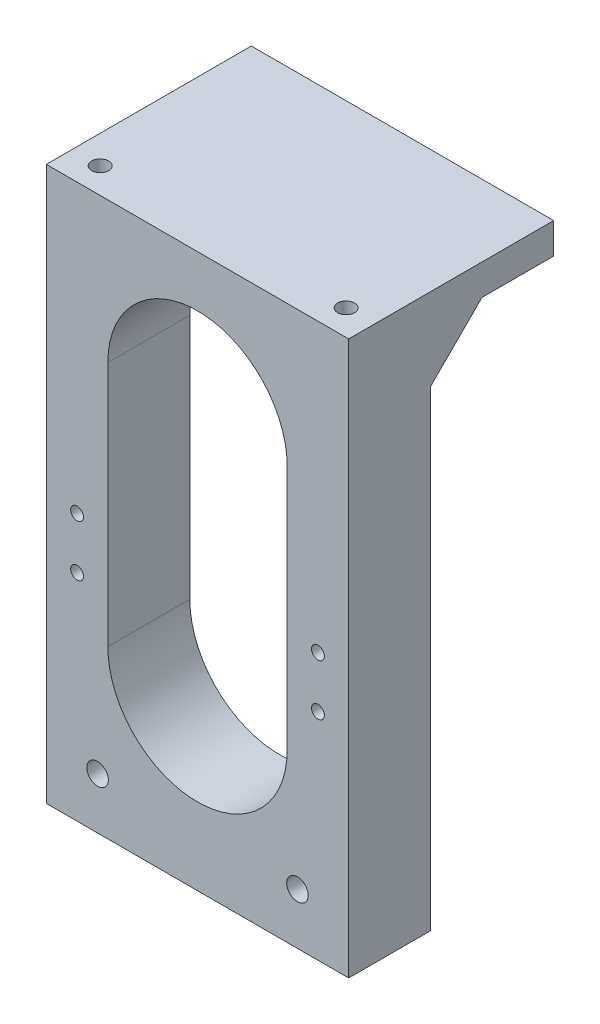
ISO-10303-21;
HEADER;
FILE_DESCRIPTION(('STEP AP214'),'2;1');
FILE_NAME('part.step','',(''),(''),'','','');
FILE_SCHEMA(('AUTOMOTIVE_DESIGN { 1 0 10303 214 1 1 1 1 }'));
ENDSEC;
DATA;
#1=APPLICATION_CONTEXT('core data for automotive mechanical design processes');
#2=APPLICATION_PROTOCOL_DEFINITION('international standard','automotive_design',2000,#1);
#3=PRODUCT_CONTEXT('',#1,'mechanical');
#4=PRODUCT('Part','Part','',(#3));
#5=PRODUCT_RELATED_PRODUCT_CATEGORY('part','',(#4));
#6=PRODUCT_DEFINITION_FORMATION('','',#4);
#7=PRODUCT_DEFINITION_CONTEXT('part definition',#1,'design');
#8=PRODUCT_DEFINITION('design','',#6,#7);
#9=PRODUCT_DEFINITION_SHAPE('','',#8);
#10=(LENGTH_UNIT() NAMED_UNIT(*) SI_UNIT(.MILLI.,.METRE.));
#11=(NAMED_UNIT(*) PLANE_ANGLE_UNIT() SI_UNIT($,.RADIAN.));
#12=(NAMED_UNIT(*) SI_UNIT($,.STERADIAN.) SOLID_ANGLE_UNIT());
#13=UNCERTAINTY_MEASURE_WITH_UNIT(LENGTH_MEASURE(1.E-05),#10,'distance_accuracy_value','');
#14=(GEOMETRIC_REPRESENTATION_CONTEXT(3) GLOBAL_UNCERTAINTY_ASSIGNED_CONTEXT((#13)) GLOBAL_UNIT_ASSIGNED_CONTEXT((#10,
#11,#12)) REPRESENTATION_CONTEXT('',''));
#15=CARTESIAN_POINT('',(0.,0.,0.));
#16=DIRECTION('',(0.,0.,1.));
#17=DIRECTION('',(1.,0.,0.));
#18=AXIS2_PLACEMENT_3D('',#15,#16,#17);
#19=CARTESIAN_POINT('',(29.5,92.,-16.));
#20=DIRECTION('',(0.,0.707106781186548,0.707106781186547));
#21=DIRECTION('',(0.,-0.707106781186547,0.707106781186548));
#22=AXIS2_PLACEMENT_3D('',#19,#20,#21);
#23=PLANE('',#22);
#24=DIRECTION('',(-1.,0.,0.));
#25=VECTOR('',#24,1.);
#26=CARTESIAN_POINT('',(29.5,92.,-16.));
#27=LINE('',#26,#25);
#28=CARTESIAN_POINT('',(29.5,92.,-16.));
#29=VERTEX_POINT('',#28);
#30=CARTESIAN_POINT('',(13.1909059582729,92.,-16.));
#31=VERTEX_POINT('',#30);
#32=EDGE_CURVE('E259',#29,#31,#27,.T.);
#33=ORIENTED_EDGE('',*,*,#32,.T.);
#34=CARTESIAN_POINT('',(0.,80.5,-4.49999999999999));
#35=DIRECTION('',(0.,0.707106781186548,0.707106781186547));
#36=DIRECTION('',(0.,-0.707106781186547,0.707106781186548));
#37=AXIS2_PLACEMENT_3D('',#34,#35,#36);
#38=ELLIPSE('',#37,24.7487373415292,17.5);
#39=CARTESIAN_POINT('',(-13.1909059582729,92.,-16.));
#40=VERTEX_POINT('',#39);
#41=EDGE_CURVE('E208',#31,#40,#38,.T.);
#42=ORIENTED_EDGE('',*,*,#41,.T.);
#43=CARTESIAN_POINT('',(-29.5,92.,-16.));
#44=VERTEX_POINT('',#43);
#45=EDGE_CURVE('E244',#40,#44,#27,.T.);
#46=ORIENTED_EDGE('',*,*,#45,.T.);
#47=DIRECTION('',(0.,0.707106781186547,-0.707106781186548));
#48=VECTOR('',#47,1.);
#49=CARTESIAN_POINT('',(-29.5,92.,-16.));
#50=LINE('',#49,#48);
#51=CARTESIAN_POINT('',(-29.5,102.,-26.));
#52=VERTEX_POINT('',#51);
#53=EDGE_CURVE('E227',#44,#52,#50,.T.);
#54=ORIENTED_EDGE('',*,*,#53,.T.);
#55=DIRECTION('',(-1.,0.,0.));
#56=VECTOR('',#55,1.);
#57=CARTESIAN_POINT('',(29.5,102.,-26.));
#58=LINE('',#57,#56);
#59=CARTESIAN_POINT('',(29.5,102.,-26.));
#60=VERTEX_POINT('',#59);
#61=EDGE_CURVE('E277',#60,#52,#58,.T.);
#62=ORIENTED_EDGE('',*,*,#61,.F.);
#63=DIRECTION('',(0.,0.707106781186547,-0.707106781186548));
#64=VECTOR('',#63,1.);
#65=CARTESIAN_POINT('',(29.5,92.,-16.));
#66=LINE('',#65,#64);
#67=EDGE_CURVE('E228',#29,#60,#66,.T.);
#68=ORIENTED_EDGE('',*,*,#67,.F.);
#69=EDGE_LOOP('',(#33,#42,#46,#54,#62,#68));
#70=FACE_BOUND('',#69,.T.);
#71=ADVANCED_FACE('F39',(#70),#23,.F.);
#72=CARTESIAN_POINT('',(29.5,102.,-26.));
#73=DIRECTION('',(0.,1.,0.));
#74=DIRECTION('',(0.,0.,1.));
#75=AXIS2_PLACEMENT_3D('',#72,#73,#74);
#76=PLANE('',#75);
#77=DIRECTION('',(0.,0.,-1.));
#78=VECTOR('',#77,1.);
#79=CARTESIAN_POINT('',(-29.5,102.,-26.));
#80=LINE('',#79,#78);
#81=CARTESIAN_POINT('',(-29.5,102.,-40.));
#82=VERTEX_POINT('',#81);
#83=EDGE_CURVE('E247',#52,#82,#80,.T.);
#84=ORIENTED_EDGE('',*,*,#83,.T.);
#85=DIRECTION('',(-1.,0.,0.));
#86=VECTOR('',#85,1.);
#87=CARTESIAN_POINT('',(29.5,102.,-40.));
#88=LINE('',#87,#86);
#89=CARTESIAN_POINT('',(29.5,102.,-40.));
#90=VERTEX_POINT('',#89);
#91=EDGE_CURVE('E274',#90,#82,#88,.T.);
#92=ORIENTED_EDGE('',*,*,#91,.F.);
#93=DIRECTION('',(0.,0.,-1.));
#94=VECTOR('',#93,1.);
#95=CARTESIAN_POINT('',(29.5,102.,-26.));
#96=LINE('',#95,#94);
#97=EDGE_CURVE('E231',#60,#90,#96,.T.);
#98=ORIENTED_EDGE('',*,*,#97,.F.);
#99=ORIENTED_EDGE('',*,*,#61,.T.);
#100=EDGE_LOOP('',(#84,#92,#98,#99));
#101=FACE_BOUND('',#100,.T.);
#102=ADVANCED_FACE('F324',(#101),#76,.F.);
#103=CARTESIAN_POINT('',(29.5,102.,-40.));
#104=DIRECTION('',(0.,0.,1.));
#105=DIRECTION('',(1.,0.,0.));
#106=AXIS2_PLACEMENT_3D('',#103,#104,#105);
#107=PLANE('',#106);
#108=DIRECTION('',(0.,1.,0.));
#109=VECTOR('',#108,1.);
#110=CARTESIAN_POINT('',(-29.5,102.,-40.));
#111=LINE('',#110,#109);
#112=CARTESIAN_POINT('',(-29.5,108.,-40.));
#113=VERTEX_POINT('',#112);
#114=EDGE_CURVE('E249',#82,#113,#111,.T.);
#115=ORIENTED_EDGE('',*,*,#114,.T.);
#116=DIRECTION('',(-1.,0.,0.));
#117=VECTOR('',#116,1.);
#118=CARTESIAN_POINT('',(29.5,108.,-40.));
#119=LINE('',#118,#117);
#120=CARTESIAN_POINT('',(29.5,108.,-40.));
#121=VERTEX_POINT('',#120);
#122=EDGE_CURVE('E271',#121,#113,#119,.T.);
#123=ORIENTED_EDGE('',*,*,#122,.F.);
#124=DIRECTION('',(0.,1.,0.));
#125=VECTOR('',#124,1.);
#126=CARTESIAN_POINT('',(29.5,102.,-40.));
#127=LINE('',#126,#125);
#128=EDGE_CURVE('E234',#90,#121,#127,.T.);
#129=ORIENTED_EDGE('',*,*,#128,.F.);
#130=ORIENTED_EDGE('',*,*,#91,.T.);
#131=EDGE_LOOP('',(#115,#123,#129,#130));
#132=FACE_BOUND('',#131,.T.);
#133=ADVANCED_FACE('F328',(#132),#107,.F.);
#134=CARTESIAN_POINT('',(29.5,108.,0.));
#135=DIRECTION('',(0.,-1.,0.));
#136=DIRECTION('',(0.,0.,-1.));
#137=AXIS2_PLACEMENT_3D('',#134,#135,#136);
#138=PLANE('',#137);
#139=CARTESIAN_POINT('',(24.,108.,-5.));
#140=DIRECTION('',(0.,1.,0.));
#141=DIRECTION('',(0.,0.,1.));
#142=AXIS2_PLACEMENT_3D('',#139,#140,#141);
#143=CIRCLE('',#142,1.64999999999999);
#144=CARTESIAN_POINT('',(24.,108.,-3.35000000000001));
#145=VERTEX_POINT('',#144);
#146=EDGE_CURVE('E215',#145,#145,#143,.T.);
#147=ORIENTED_EDGE('',*,*,#146,.F.);
#148=EDGE_LOOP('',(#147));
#149=FACE_BOUND('',#148,.T.);
#150=CARTESIAN_POINT('',(-24.,108.,-5.));
#151=DIRECTION('',(0.,1.,0.));
#152=DIRECTION('',(0.,0.,1.));
#153=AXIS2_PLACEMENT_3D('',#150,#151,#152);
#154=CIRCLE('',#153,1.64999999999999);
#155=CARTESIAN_POINT('',(-24.,108.,-3.35000000000001));
#156=VERTEX_POINT('',#155);
#157=EDGE_CURVE('E221',#156,#156,#154,.T.);
#158=ORIENTED_EDGE('',*,*,#157,.F.);
#159=EDGE_LOOP('',(#158));
#160=FACE_BOUND('',#159,.T.);
#161=DIRECTION('',(0.,0.,1.));
#162=VECTOR('',#161,1.);
#163=CARTESIAN_POINT('',(-29.5,108.,0.));
#164=LINE('',#163,#162);
#165=CARTESIAN_POINT('',(-29.5,108.,0.));
#166=VERTEX_POINT('',#165);
#167=EDGE_CURVE('E251',#113,#166,#164,.T.);
#168=ORIENTED_EDGE('',*,*,#167,.T.);
#169=DIRECTION('',(-1.,0.,0.));
#170=VECTOR('',#169,1.);
#171=CARTESIAN_POINT('',(29.5,108.,0.));
#172=LINE('',#171,#170);
#173=CARTESIAN_POINT('',(29.5,108.,0.));
#174=VERTEX_POINT('',#173);
#175=EDGE_CURVE('E268',#174,#166,#172,.T.);
#176=ORIENTED_EDGE('',*,*,#175,.F.);
#177=DIRECTION('',(0.,0.,1.));
#178=VECTOR('',#177,1.);
#179=CARTESIAN_POINT('',(29.5,108.,0.));
#180=LINE('',#179,#178);
#181=EDGE_CURVE('E236',#121,#174,#180,.T.);
#182=ORIENTED_EDGE('',*,*,#181,.F.);
#183=ORIENTED_EDGE('',*,*,#122,.T.);
#184=EDGE_LOOP('',(#168,#176,#182,#183));
#185=FACE_BOUND('',#184,.T.);
#186=ADVANCED_FACE('F333',(#149,#160,#185),#138,.F.);
#187=CARTESIAN_POINT('',(29.5,0.,0.));
#188=DIRECTION('',(0.,0.,-1.));
#189=DIRECTION('',(0.,1.,0.));
#190=AXIS2_PLACEMENT_3D('',#187,#188,#189);
#191=PLANE('',#190);
#192=CARTESIAN_POINT('',(23.5,42.,0.));
#193=DIRECTION('',(0.,0.,1.));
#194=DIRECTION('',(1.,0.,0.));
#195=AXIS2_PLACEMENT_3D('',#192,#193,#194);
#196=CIRCLE('',#195,1.24999999999999);
#197=CARTESIAN_POINT('',(24.75,42.,0.));
#198=VERTEX_POINT('',#197);
#199=EDGE_CURVE('E158',#198,#198,#196,.T.);
#200=ORIENTED_EDGE('',*,*,#199,.F.);
#201=EDGE_LOOP('',(#200));
#202=FACE_BOUND('',#201,.T.);
#203=CARTESIAN_POINT('',(-23.5,52.,0.));
#204=DIRECTION('',(0.,0.,1.));
#205=DIRECTION('',(1.,0.,0.));
#206=AXIS2_PLACEMENT_3D('',#203,#204,#205);
#207=CIRCLE('',#206,1.24999999999999);
#208=CARTESIAN_POINT('',(-22.25,52.,0.));
#209=VERTEX_POINT('',#208);
#210=EDGE_CURVE('E169',#209,#209,#207,.T.);
#211=ORIENTED_EDGE('',*,*,#210,.F.);
#212=EDGE_LOOP('',(#211));
#213=FACE_BOUND('',#212,.T.);
#214=CARTESIAN_POINT('',(-23.5,42.,0.));
#215=DIRECTION('',(0.,0.,1.));
#216=DIRECTION('',(1.,0.,0.));
#217=AXIS2_PLACEMENT_3D('',#214,#215,#216);
#218=CIRCLE('',#217,1.24999999999999);
#219=CARTESIAN_POINT('',(-22.25,42.,0.));
#220=VERTEX_POINT('',#219);
#221=EDGE_CURVE('E175',#220,#220,#218,.T.);
#222=ORIENTED_EDGE('',*,*,#221,.F.);
#223=EDGE_LOOP('',(#222));
#224=FACE_BOUND('',#223,.T.);
#225=CARTESIAN_POINT('',(23.5,52.,0.));
#226=DIRECTION('',(0.,0.,1.));
#227=DIRECTION('',(1.,0.,0.));
#228=AXIS2_PLACEMENT_3D('',#225,#226,#227);
#229=CIRCLE('',#228,1.24999999999999);
#230=CARTESIAN_POINT('',(24.75,52.,0.));
#231=VERTEX_POINT('',#230);
#232=EDGE_CURVE('E181',#231,#231,#229,.T.);
#233=ORIENTED_EDGE('',*,*,#232,.F.);
#234=EDGE_LOOP('',(#233));
#235=FACE_BOUND('',#234,.T.);
#236=CARTESIAN_POINT('',(-19.5,10.,0.));
#237=DIRECTION('',(0.,0.,1.));
#238=DIRECTION('',(1.,0.,0.));
#239=AXIS2_PLACEMENT_3D('',#236,#237,#238);
#240=CIRCLE('',#239,2.09999999999999);
#241=CARTESIAN_POINT('',(-17.4,10.,0.));
#242=VERTEX_POINT('',#241);
#243=EDGE_CURVE('E187',#242,#242,#240,.T.);
#244=ORIENTED_EDGE('',*,*,#243,.F.);
#245=EDGE_LOOP('',(#244));
#246=FACE_BOUND('',#245,.T.);
#247=CARTESIAN_POINT('',(19.5,10.,0.));
#248=DIRECTION('',(0.,0.,1.));
#249=DIRECTION('',(1.,0.,0.));
#250=AXIS2_PLACEMENT_3D('',#247,#248,#249);
#251=CIRCLE('',#250,2.09999999999999);
#252=CARTESIAN_POINT('',(21.6,10.,0.));
#253=VERTEX_POINT('',#252);
#254=EDGE_CURVE('E190',#253,#253,#251,.T.);
#255=ORIENTED_EDGE('',*,*,#254,.F.);
#256=EDGE_LOOP('',(#255));
#257=FACE_BOUND('',#256,.T.);
#258=DIRECTION('',(0.,-1.,0.));
#259=VECTOR('',#258,1.);
#260=CARTESIAN_POINT('',(-17.5,80.5,0.));
#261=LINE('',#260,#259);
#262=CARTESIAN_POINT('',(-17.5,80.5,0.));
#263=VERTEX_POINT('',#262);
#264=CARTESIAN_POINT('',(-17.5,32.5,0.));
#265=VERTEX_POINT('',#264);
#266=EDGE_CURVE('E197',#263,#265,#261,.T.);
#267=ORIENTED_EDGE('',*,*,#266,.F.);
#268=CARTESIAN_POINT('',(0.,80.5,0.));
#269=DIRECTION('',(0.,0.,1.));
#270=DIRECTION('',(1.,0.,0.));
#271=AXIS2_PLACEMENT_3D('',#268,#269,#270);
#272=CIRCLE('',#271,17.5);
#273=CARTESIAN_POINT('',(17.5,80.5,0.));
#274=VERTEX_POINT('',#273);
#275=EDGE_CURVE('E54',#274,#263,#272,.T.);
#276=ORIENTED_EDGE('',*,*,#275,.F.);
#277=DIRECTION('',(0.,1.,0.));
#278=VECTOR('',#277,1.);
#279=CARTESIAN_POINT('',(17.5,80.5,0.));
#280=LINE('',#279,#278);
#281=CARTESIAN_POINT('',(17.5,32.5,0.));
#282=VERTEX_POINT('',#281);
#283=EDGE_CURVE('E202',#282,#274,#280,.T.);
#284=ORIENTED_EDGE('',*,*,#283,.F.);
#285=CARTESIAN_POINT('',(0.,32.5,0.));
#286=DIRECTION('',(0.,0.,1.));
#287=DIRECTION('',(1.,0.,0.));
#288=AXIS2_PLACEMENT_3D('',#285,#286,#287);
#289=CIRCLE('',#288,17.5);
#290=EDGE_CURVE('E199',#265,#282,#289,.T.);
#291=ORIENTED_EDGE('',*,*,#290,.F.);
#292=EDGE_LOOP('',(#267,#276,#284,#291));
#293=FACE_BOUND('',#292,.T.);
#294=DIRECTION('',(0.,-1.,0.));
#295=VECTOR('',#294,1.);
#296=CARTESIAN_POINT('',(-29.5,0.,0.));
#297=LINE('',#296,#295);
#298=CARTESIAN_POINT('',(-29.5,0.,0.));
#299=VERTEX_POINT('',#298);
#300=EDGE_CURVE('E253',#166,#299,#297,.T.);
#301=ORIENTED_EDGE('',*,*,#300,.T.);
#302=DIRECTION('',(-1.,0.,0.));
#303=VECTOR('',#302,1.);
#304=CARTESIAN_POINT('',(29.5,0.,0.));
#305=LINE('',#304,#303);
#306=CARTESIAN_POINT('',(29.5,0.,0.));
#307=VERTEX_POINT('',#306);
#308=EDGE_CURVE('E265',#307,#299,#305,.T.);
#309=ORIENTED_EDGE('',*,*,#308,.F.);
#310=DIRECTION('',(0.,-1.,0.));
#311=VECTOR('',#310,1.);
#312=CARTESIAN_POINT('',(29.5,0.,0.));
#313=LINE('',#312,#311);
#314=EDGE_CURVE('E238',#174,#307,#313,.T.);
#315=ORIENTED_EDGE('',*,*,#314,.F.);
#316=ORIENTED_EDGE('',*,*,#175,.T.);
#317=EDGE_LOOP('',(#301,#309,#315,#316));
#318=FACE_BOUND('',#317,.T.);
#319=ADVANCED_FACE('F306',(#202,#213,#224,#235,#246,#257,#293,#318),#191,.F.);
#320=CARTESIAN_POINT('',(29.5,0.,0.));
#321=DIRECTION('',(0.,1.,0.));
#322=DIRECTION('',(0.,0.,1.));
#323=AXIS2_PLACEMENT_3D('',#320,#321,#322);
#324=PLANE('',#323);
#325=CARTESIAN_POINT('',(0.,0.,-7.99999999999999));
#326=DIRECTION('',(0.,-1.,0.));
#327=DIRECTION('',(0.,0.,-1.));
#328=AXIS2_PLACEMENT_3D('',#325,#326,#327);
#329=CIRCLE('',#328,1.65);
#330=CARTESIAN_POINT('',(0.,0.,-9.64999999999999));
#331=VERTEX_POINT('',#330);
#332=EDGE_CURVE('E159',#331,#331,#329,.T.);
#333=ORIENTED_EDGE('',*,*,#332,.F.);
#334=EDGE_LOOP('',(#333));
#335=FACE_BOUND('',#334,.T.);
#336=DIRECTION('',(0.,0.,-1.));
#337=VECTOR('',#336,1.);
#338=CARTESIAN_POINT('',(-29.5,0.,0.));
#339=LINE('',#338,#337);
#340=CARTESIAN_POINT('',(-29.5,0.,-16.));
#341=VERTEX_POINT('',#340);
#342=EDGE_CURVE('E255',#299,#341,#339,.T.);
#343=ORIENTED_EDGE('',*,*,#342,.T.);
#344=DIRECTION('',(-1.,0.,0.));
#345=VECTOR('',#344,1.);
#346=CARTESIAN_POINT('',(29.5,0.,-16.));
#347=LINE('',#346,#345);
#348=CARTESIAN_POINT('',(29.5,0.,-16.));
#349=VERTEX_POINT('',#348);
#350=EDGE_CURVE('E262',#349,#341,#347,.T.);
#351=ORIENTED_EDGE('',*,*,#350,.F.);
#352=DIRECTION('',(0.,0.,-1.));
#353=VECTOR('',#352,1.);
#354=CARTESIAN_POINT('',(29.5,0.,0.));
#355=LINE('',#354,#353);
#356=EDGE_CURVE('E240',#307,#349,#355,.T.);
#357=ORIENTED_EDGE('',*,*,#356,.F.);
#358=ORIENTED_EDGE('',*,*,#308,.T.);
#359=EDGE_LOOP('',(#343,#351,#357,#358));
#360=FACE_BOUND('',#359,.T.);
#361=ADVANCED_FACE('F342',(#335,#360),#324,.F.);
#362=CARTESIAN_POINT('',(29.5,92.,-16.));
#363=DIRECTION('',(0.,0.,1.));
#364=DIRECTION('',(0.,-1.,0.));
#365=AXIS2_PLACEMENT_3D('',#362,#363,#364);
#366=PLANE('',#365);
#367=CARTESIAN_POINT('',(-19.5,10.,-16.));
#368=DIRECTION('',(0.,0.,1.));
#369=DIRECTION('',(0.,-1.,0.));
#370=AXIS2_PLACEMENT_3D('',#367,#368,#369);
#371=CIRCLE('',#370,2.09999999999999);
#372=CARTESIAN_POINT('',(-19.5,7.90000000000001,-16.));
#373=VERTEX_POINT('',#372);
#374=EDGE_CURVE('E42',#373,#373,#371,.T.);
#375=ORIENTED_EDGE('',*,*,#374,.T.);
#376=EDGE_LOOP('',(#375));
#377=FACE_BOUND('',#376,.T.);
#378=CARTESIAN_POINT('',(19.5,10.,-16.));
#379=DIRECTION('',(0.,0.,1.));
#380=DIRECTION('',(0.,-1.,0.));
#381=AXIS2_PLACEMENT_3D('',#378,#379,#380);
#382=CIRCLE('',#381,2.09999999999999);
#383=CARTESIAN_POINT('',(19.5,7.90000000000001,-16.));
#384=VERTEX_POINT('',#383);
#385=EDGE_CURVE('E193',#384,#384,#382,.T.);
#386=ORIENTED_EDGE('',*,*,#385,.T.);
#387=EDGE_LOOP('',(#386));
#388=FACE_BOUND('',#387,.T.);
#389=DIRECTION('',(0.,1.,0.));
#390=VECTOR('',#389,1.);
#391=CARTESIAN_POINT('',(17.5,92.,-16.));
#392=LINE('',#391,#390);
#393=CARTESIAN_POINT('',(17.5,32.5,-16.));
#394=VERTEX_POINT('',#393);
#395=CARTESIAN_POINT('',(17.5,80.5,-16.));
#396=VERTEX_POINT('',#395);
#397=EDGE_CURVE('E286',#394,#396,#392,.T.);
#398=ORIENTED_EDGE('',*,*,#397,.T.);
#399=CARTESIAN_POINT('',(0.,80.5,-16.));
#400=DIRECTION('',(0.,0.,1.));
#401=DIRECTION('',(0.,-1.,0.));
#402=AXIS2_PLACEMENT_3D('',#399,#400,#401);
#403=CIRCLE('',#402,17.5);
#404=EDGE_CURVE('E11',#396,#31,#403,.T.);
#405=ORIENTED_EDGE('',*,*,#404,.T.);
#406=ORIENTED_EDGE('',*,*,#32,.F.);
#407=DIRECTION('',(0.,1.,0.));
#408=VECTOR('',#407,1.);
#409=CARTESIAN_POINT('',(29.5,92.,-16.));
#410=LINE('',#409,#408);
#411=EDGE_CURVE('E242',#349,#29,#410,.T.);
#412=ORIENTED_EDGE('',*,*,#411,.F.);
#413=ORIENTED_EDGE('',*,*,#350,.T.);
#414=DIRECTION('',(0.,1.,0.));
#415=VECTOR('',#414,1.);
#416=CARTESIAN_POINT('',(-29.5,92.,-16.));
#417=LINE('',#416,#415);
#418=EDGE_CURVE('E232',#341,#44,#417,.T.);
#419=ORIENTED_EDGE('',*,*,#418,.T.);
#420=ORIENTED_EDGE('',*,*,#45,.F.);
#421=CARTESIAN_POINT('',(-17.5,80.5,-16.));
#422=VERTEX_POINT('',#421);
#423=EDGE_CURVE('E47',#40,#422,#403,.T.);
#424=ORIENTED_EDGE('',*,*,#423,.T.);
#425=DIRECTION('',(0.,-1.,0.));
#426=VECTOR('',#425,1.);
#427=CARTESIAN_POINT('',(-17.5,92.,-16.));
#428=LINE('',#427,#426);
#429=CARTESIAN_POINT('',(-17.5,32.5,-16.));
#430=VERTEX_POINT('',#429);
#431=EDGE_CURVE('E280',#422,#430,#428,.T.);
#432=ORIENTED_EDGE('',*,*,#431,.T.);
#433=CARTESIAN_POINT('',(0.,32.5,-16.));
#434=DIRECTION('',(0.,0.,1.));
#435=DIRECTION('',(0.,-1.,0.));
#436=AXIS2_PLACEMENT_3D('',#433,#434,#435);
#437=CIRCLE('',#436,17.5);
#438=EDGE_CURVE('E283',#430,#394,#437,.T.);
#439=ORIENTED_EDGE('',*,*,#438,.T.);
#440=EDGE_LOOP('',(#398,#405,#406,#412,#413,#419,#420,#424,#432,#439));
#441=FACE_BOUND('',#440,.T.);
#442=ADVANCED_FACE('F291',(#377,#388,#441),#366,.F.);
#443=CARTESIAN_POINT('',(29.5,0.,0.));
#444=DIRECTION('',(-1.,0.,0.));
#445=DIRECTION('',(0.,0.,1.));
#446=AXIS2_PLACEMENT_3D('',#443,#444,#445);
#447=PLANE('',#446);
#448=ORIENTED_EDGE('',*,*,#67,.T.);
#449=ORIENTED_EDGE('',*,*,#97,.T.);
#450=ORIENTED_EDGE('',*,*,#128,.T.);
#451=ORIENTED_EDGE('',*,*,#181,.T.);
#452=ORIENTED_EDGE('',*,*,#314,.T.);
#453=ORIENTED_EDGE('',*,*,#356,.T.);
#454=ORIENTED_EDGE('',*,*,#411,.T.);
#455=EDGE_LOOP('',(#448,#449,#450,#451,#452,#453,#454));
#456=FACE_BOUND('',#455,.T.);
#457=ADVANCED_FACE('F349',(#456),#447,.F.);
#458=CARTESIAN_POINT('',(-29.5,0.,0.));
#459=DIRECTION('',(-1.,0.,0.));
#460=DIRECTION('',(0.,0.,1.));
#461=AXIS2_PLACEMENT_3D('',#458,#459,#460);
#462=PLANE('',#461);
#463=ORIENTED_EDGE('',*,*,#53,.F.);
#464=ORIENTED_EDGE('',*,*,#418,.F.);
#465=ORIENTED_EDGE('',*,*,#342,.F.);
#466=ORIENTED_EDGE('',*,*,#300,.F.);
#467=ORIENTED_EDGE('',*,*,#167,.F.);
#468=ORIENTED_EDGE('',*,*,#114,.F.);
#469=ORIENTED_EDGE('',*,*,#83,.F.);
#470=EDGE_LOOP('',(#463,#464,#465,#466,#467,#468,#469));
#471=FACE_BOUND('',#470,.T.);
#472=ADVANCED_FACE('F351',(#471),#462,.T.);
#473=CARTESIAN_POINT('',(-24.,96.5,-5.));
#474=DIRECTION('',(0.,1.,0.));
#475=DIRECTION('',(0.,0.,1.));
#476=AXIS2_PLACEMENT_3D('',#473,#474,#475);
#477=CONICAL_SURFACE('',#476,1.65,1.02974425867665);
#478=CARTESIAN_POINT('',(-24.,95.5085799786045,-5.));
#479=VERTEX_POINT('',#478);
#480=VERTEX_LOOP('',#479);
#481=FACE_BOUND('',#480,.T.);
#482=CARTESIAN_POINT('',(-24.,96.5,-5.));
#483=DIRECTION('',(0.,1.,0.));
#484=DIRECTION('',(0.,0.,1.));
#485=AXIS2_PLACEMENT_3D('',#482,#483,#484);
#486=CIRCLE('',#485,1.65);
#487=CARTESIAN_POINT('',(-24.,96.5,-3.35));
#488=VERTEX_POINT('',#487);
#489=EDGE_CURVE('E224',#488,#488,#486,.T.);
#490=ORIENTED_EDGE('',*,*,#489,.T.);
#491=EDGE_LOOP('',(#490));
#492=FACE_BOUND('',#491,.T.);
#493=ADVANCED_FACE('F354',(#481,#492),#477,.F.);
#494=CARTESIAN_POINT('',(-24.,108.,-5.));
#495=DIRECTION('',(0.,1.,0.));
#496=DIRECTION('',(0.,0.,1.));
#497=AXIS2_PLACEMENT_3D('',#494,#495,#496);
#498=CYLINDRICAL_SURFACE('',#497,1.64999999999999);
#499=ORIENTED_EDGE('',*,*,#489,.F.);
#500=EDGE_LOOP('',(#499));
#501=FACE_BOUND('',#500,.T.);
#502=ORIENTED_EDGE('',*,*,#157,.T.);
#503=EDGE_LOOP('',(#502));
#504=FACE_BOUND('',#503,.T.);
#505=ADVANCED_FACE('F361',(#501,#504),#498,.F.);
#506=CARTESIAN_POINT('',(24.,96.5,-5.));
#507=DIRECTION('',(0.,1.,0.));
#508=DIRECTION('',(0.,0.,1.));
#509=AXIS2_PLACEMENT_3D('',#506,#507,#508);
#510=CONICAL_SURFACE('',#509,1.65,1.02974425867665);
#511=CARTESIAN_POINT('',(24.,95.5085799786045,-5.));
#512=VERTEX_POINT('',#511);
#513=VERTEX_LOOP('',#512);
#514=FACE_BOUND('',#513,.T.);
#515=CARTESIAN_POINT('',(24.,96.5,-5.));
#516=DIRECTION('',(0.,1.,0.));
#517=DIRECTION('',(0.,0.,1.));
#518=AXIS2_PLACEMENT_3D('',#515,#516,#517);
#519=CIRCLE('',#518,1.65);
#520=CARTESIAN_POINT('',(24.,96.5,-3.35));
#521=VERTEX_POINT('',#520);
#522=EDGE_CURVE('E218',#521,#521,#519,.T.);
#523=ORIENTED_EDGE('',*,*,#522,.T.);
#524=EDGE_LOOP('',(#523));
#525=FACE_BOUND('',#524,.T.);
#526=ADVANCED_FACE('F365',(#514,#525),#510,.F.);
#527=CARTESIAN_POINT('',(24.,108.,-5.));
#528=DIRECTION('',(0.,1.,0.));
#529=DIRECTION('',(0.,0.,1.));
#530=AXIS2_PLACEMENT_3D('',#527,#528,#529);
#531=CYLINDRICAL_SURFACE('',#530,1.64999999999999);
#532=ORIENTED_EDGE('',*,*,#522,.F.);
#533=EDGE_LOOP('',(#532));
#534=FACE_BOUND('',#533,.T.);
#535=ORIENTED_EDGE('',*,*,#146,.T.);
#536=EDGE_LOOP('',(#535));
#537=FACE_BOUND('',#536,.T.);
#538=ADVANCED_FACE('F369',(#534,#537),#531,.F.);
#539=CARTESIAN_POINT('',(0.,80.5,-40.));
#540=DIRECTION('',(0.,0.,1.));
#541=DIRECTION('',(1.,0.,0.));
#542=AXIS2_PLACEMENT_3D('',#539,#540,#541);
#543=CYLINDRICAL_SURFACE('',#542,17.5);
#544=DIRECTION('',(0.,0.,1.));
#545=VECTOR('',#544,1.);
#546=CARTESIAN_POINT('',(17.5,80.5,-40.));
#547=LINE('',#546,#545);
#548=EDGE_CURVE('E206',#396,#274,#547,.T.);
#549=ORIENTED_EDGE('',*,*,#548,.T.);
#550=ORIENTED_EDGE('',*,*,#275,.T.);
#551=DIRECTION('',(0.,0.,1.));
#552=VECTOR('',#551,1.);
#553=CARTESIAN_POINT('',(-17.5,80.5,-40.));
#554=LINE('',#553,#552);
#555=EDGE_CURVE('E205',#422,#263,#554,.T.);
#556=ORIENTED_EDGE('',*,*,#555,.F.);
#557=ORIENTED_EDGE('',*,*,#423,.F.);
#558=ORIENTED_EDGE('',*,*,#41,.F.);
#559=ORIENTED_EDGE('',*,*,#404,.F.);
#560=EDGE_LOOP('',(#549,#550,#556,#557,#558,#559));
#561=FACE_BOUND('',#560,.T.);
#562=ADVANCED_FACE('F292',(#561),#543,.F.);
#563=CARTESIAN_POINT('',(17.5,80.5,-40.));
#564=DIRECTION('',(1.,0.,0.));
#565=DIRECTION('',(0.,1.,0.));
#566=AXIS2_PLACEMENT_3D('',#563,#564,#565);
#567=PLANE('',#566);
#568=DIRECTION('',(0.,0.,1.));
#569=VECTOR('',#568,1.);
#570=CARTESIAN_POINT('',(17.5,32.5,-40.));
#571=LINE('',#570,#569);
#572=EDGE_CURVE('E209',#394,#282,#571,.T.);
#573=ORIENTED_EDGE('',*,*,#572,.T.);
#574=ORIENTED_EDGE('',*,*,#283,.T.);
#575=ORIENTED_EDGE('',*,*,#548,.F.);
#576=ORIENTED_EDGE('',*,*,#397,.F.);
#577=EDGE_LOOP('',(#573,#574,#575,#576));
#578=FACE_BOUND('',#577,.T.);
#579=ADVANCED_FACE('F300',(#578),#567,.F.);
#580=CARTESIAN_POINT('',(0.,32.5,-40.));
#581=DIRECTION('',(0.,0.,1.));
#582=DIRECTION('',(1.,0.,0.));
#583=AXIS2_PLACEMENT_3D('',#580,#581,#582);
#584=CYLINDRICAL_SURFACE('',#583,17.5);
#585=DIRECTION('',(0.,0.,1.));
#586=VECTOR('',#585,1.);
#587=CARTESIAN_POINT('',(-17.5,32.5,-40.));
#588=LINE('',#587,#586);
#589=EDGE_CURVE('E62',#430,#265,#588,.T.);
#590=ORIENTED_EDGE('',*,*,#589,.T.);
#591=ORIENTED_EDGE('',*,*,#290,.T.);
#592=ORIENTED_EDGE('',*,*,#572,.F.);
#593=ORIENTED_EDGE('',*,*,#438,.F.);
#594=EDGE_LOOP('',(#590,#591,#592,#593));
#595=FACE_BOUND('',#594,.T.);
#596=ADVANCED_FACE('F311',(#595),#584,.F.);
#597=CARTESIAN_POINT('',(-17.5,80.5,-40.));
#598=DIRECTION('',(-1.,0.,0.));
#599=DIRECTION('',(0.,-1.,0.));
#600=AXIS2_PLACEMENT_3D('',#597,#598,#599);
#601=PLANE('',#600);
#602=ORIENTED_EDGE('',*,*,#555,.T.);
#603=ORIENTED_EDGE('',*,*,#266,.T.);
#604=ORIENTED_EDGE('',*,*,#589,.F.);
#605=ORIENTED_EDGE('',*,*,#431,.F.);
#606=EDGE_LOOP('',(#602,#603,#604,#605));
#607=FACE_BOUND('',#606,.T.);
#608=ADVANCED_FACE('F308',(#607),#601,.F.);
#609=CARTESIAN_POINT('',(19.5,10.,0.));
#610=DIRECTION('',(0.,0.,1.));
#611=DIRECTION('',(1.,0.,0.));
#612=AXIS2_PLACEMENT_3D('',#609,#610,#611);
#613=CYLINDRICAL_SURFACE('',#612,2.09999999999999);
#614=ORIENTED_EDGE('',*,*,#254,.T.);
#615=EDGE_LOOP('',(#614));
#616=FACE_BOUND('',#615,.T.);
#617=ORIENTED_EDGE('',*,*,#385,.F.);
#618=EDGE_LOOP('',(#617));
#619=FACE_BOUND('',#618,.T.);
#620=ADVANCED_FACE('F310',(#616,#619),#613,.F.);
#621=CARTESIAN_POINT('',(-19.5,10.,0.));
#622=DIRECTION('',(0.,0.,1.));
#623=DIRECTION('',(1.,0.,0.));
#624=AXIS2_PLACEMENT_3D('',#621,#622,#623);
#625=CYLINDRICAL_SURFACE('',#624,2.09999999999999);
#626=ORIENTED_EDGE('',*,*,#243,.T.);
#627=EDGE_LOOP('',(#626));
#628=FACE_BOUND('',#627,.T.);
#629=ORIENTED_EDGE('',*,*,#374,.F.);
#630=EDGE_LOOP('',(#629));
#631=FACE_BOUND('',#630,.T.);
#632=ADVANCED_FACE('F317',(#628,#631),#625,.F.);
#633=CARTESIAN_POINT('',(23.5,52.,-8.5));
#634=DIRECTION('',(0.,0.,1.));
#635=DIRECTION('',(1.,0.,0.));
#636=AXIS2_PLACEMENT_3D('',#633,#634,#635);
#637=CONICAL_SURFACE('',#636,1.25,1.02974425867665);
#638=CARTESIAN_POINT('',(23.5,52.,-9.25107577378445));
#639=VERTEX_POINT('',#638);
#640=VERTEX_LOOP('',#639);
#641=FACE_BOUND('',#640,.T.);
#642=CARTESIAN_POINT('',(23.5,52.,-8.5));
#643=DIRECTION('',(0.,0.,1.));
#644=DIRECTION('',(1.,0.,0.));
#645=AXIS2_PLACEMENT_3D('',#642,#643,#644);
#646=CIRCLE('',#645,1.25);
#647=CARTESIAN_POINT('',(24.75,52.,-8.5));
#648=VERTEX_POINT('',#647);
#649=EDGE_CURVE('E184',#648,#648,#646,.T.);
#650=ORIENTED_EDGE('',*,*,#649,.T.);
#651=EDGE_LOOP('',(#650));
#652=FACE_BOUND('',#651,.T.);
#653=ADVANCED_FACE('F383',(#641,#652),#637,.F.);
#654=CARTESIAN_POINT('',(23.5,52.,0.));
#655=DIRECTION('',(0.,0.,1.));
#656=DIRECTION('',(1.,0.,0.));
#657=AXIS2_PLACEMENT_3D('',#654,#655,#656);
#658=CYLINDRICAL_SURFACE('',#657,1.24999999999999);
#659=ORIENTED_EDGE('',*,*,#649,.F.);
#660=EDGE_LOOP('',(#659));
#661=FACE_BOUND('',#660,.T.);
#662=ORIENTED_EDGE('',*,*,#232,.T.);
#663=EDGE_LOOP('',(#662));
#664=FACE_BOUND('',#663,.T.);
#665=ADVANCED_FACE('F387',(#661,#664),#658,.F.);
#666=CARTESIAN_POINT('',(-23.5,42.,-8.5));
#667=DIRECTION('',(0.,0.,1.));
#668=DIRECTION('',(1.,0.,0.));
#669=AXIS2_PLACEMENT_3D('',#666,#667,#668);
#670=CONICAL_SURFACE('',#669,1.25,1.02974425867665);
#671=CARTESIAN_POINT('',(-23.5,42.,-9.25107577378445));
#672=VERTEX_POINT('',#671);
#673=VERTEX_LOOP('',#672);
#674=FACE_BOUND('',#673,.T.);
#675=CARTESIAN_POINT('',(-23.5,42.,-8.5));
#676=DIRECTION('',(0.,0.,1.));
#677=DIRECTION('',(1.,0.,0.));
#678=AXIS2_PLACEMENT_3D('',#675,#676,#677);
#679=CIRCLE('',#678,1.25);
#680=CARTESIAN_POINT('',(-22.25,42.,-8.5));
#681=VERTEX_POINT('',#680);
#682=EDGE_CURVE('E178',#681,#681,#679,.T.);
#683=ORIENTED_EDGE('',*,*,#682,.T.);
#684=EDGE_LOOP('',(#683));
#685=FACE_BOUND('',#684,.T.);
#686=ADVANCED_FACE('F391',(#674,#685),#670,.F.);
#687=CARTESIAN_POINT('',(-23.5,42.,0.));
#688=DIRECTION('',(0.,0.,1.));
#689=DIRECTION('',(1.,0.,0.));
#690=AXIS2_PLACEMENT_3D('',#687,#688,#689);
#691=CYLINDRICAL_SURFACE('',#690,1.24999999999999);
#692=ORIENTED_EDGE('',*,*,#682,.F.);
#693=EDGE_LOOP('',(#692));
#694=FACE_BOUND('',#693,.T.);
#695=ORIENTED_EDGE('',*,*,#221,.T.);
#696=EDGE_LOOP('',(#695));
#697=FACE_BOUND('',#696,.T.);
#698=ADVANCED_FACE('F395',(#694,#697),#691,.F.);
#699=CARTESIAN_POINT('',(-23.5,52.,-8.5));
#700=DIRECTION('',(0.,0.,1.));
#701=DIRECTION('',(1.,0.,0.));
#702=AXIS2_PLACEMENT_3D('',#699,#700,#701);
#703=CONICAL_SURFACE('',#702,1.25,1.02974425867665);
#704=CARTESIAN_POINT('',(-23.5,52.,-9.25107577378445));
#705=VERTEX_POINT('',#704);
#706=VERTEX_LOOP('',#705);
#707=FACE_BOUND('',#706,.T.);
#708=CARTESIAN_POINT('',(-23.5,52.,-8.5));
#709=DIRECTION('',(0.,0.,1.));
#710=DIRECTION('',(1.,0.,0.));
#711=AXIS2_PLACEMENT_3D('',#708,#709,#710);
#712=CIRCLE('',#711,1.25);
#713=CARTESIAN_POINT('',(-22.25,52.,-8.5));
#714=VERTEX_POINT('',#713);
#715=EDGE_CURVE('E172',#714,#714,#712,.T.);
#716=ORIENTED_EDGE('',*,*,#715,.T.);
#717=EDGE_LOOP('',(#716));
#718=FACE_BOUND('',#717,.T.);
#719=ADVANCED_FACE('F399',(#707,#718),#703,.F.);
#720=CARTESIAN_POINT('',(-23.5,52.,0.));
#721=DIRECTION('',(0.,0.,1.));
#722=DIRECTION('',(1.,0.,0.));
#723=AXIS2_PLACEMENT_3D('',#720,#721,#722);
#724=CYLINDRICAL_SURFACE('',#723,1.24999999999999);
#725=ORIENTED_EDGE('',*,*,#715,.F.);
#726=EDGE_LOOP('',(#725));
#727=FACE_BOUND('',#726,.T.);
#728=ORIENTED_EDGE('',*,*,#210,.T.);
#729=EDGE_LOOP('',(#728));
#730=FACE_BOUND('',#729,.T.);
#731=ADVANCED_FACE('F403',(#727,#730),#724,.F.);
#732=CARTESIAN_POINT('',(23.5,42.,-8.5));
#733=DIRECTION('',(0.,0.,1.));
#734=DIRECTION('',(1.,0.,0.));
#735=AXIS2_PLACEMENT_3D('',#732,#733,#734);
#736=CONICAL_SURFACE('',#735,1.25,1.02974425867665);
#737=CARTESIAN_POINT('',(23.5,42.,-9.25107577378445));
#738=VERTEX_POINT('',#737);
#739=VERTEX_LOOP('',#738);
#740=FACE_BOUND('',#739,.T.);
#741=CARTESIAN_POINT('',(23.5,42.,-8.5));
#742=DIRECTION('',(0.,0.,1.));
#743=DIRECTION('',(1.,0.,0.));
#744=AXIS2_PLACEMENT_3D('',#741,#742,#743);
#745=CIRCLE('',#744,1.25);
#746=CARTESIAN_POINT('',(24.75,42.,-8.5));
#747=VERTEX_POINT('',#746);
#748=EDGE_CURVE('E162',#747,#747,#745,.T.);
#749=ORIENTED_EDGE('',*,*,#748,.T.);
#750=EDGE_LOOP('',(#749));
#751=FACE_BOUND('',#750,.T.);
#752=ADVANCED_FACE('F407',(#740,#751),#736,.F.);
#753=CARTESIAN_POINT('',(23.5,42.,0.));
#754=DIRECTION('',(0.,0.,1.));
#755=DIRECTION('',(1.,0.,0.));
#756=AXIS2_PLACEMENT_3D('',#753,#754,#755);
#757=CYLINDRICAL_SURFACE('',#756,1.24999999999999);
#758=ORIENTED_EDGE('',*,*,#748,.F.);
#759=EDGE_LOOP('',(#758));
#760=FACE_BOUND('',#759,.T.);
#761=ORIENTED_EDGE('',*,*,#199,.T.);
#762=EDGE_LOOP('',(#761));
#763=FACE_BOUND('',#762,.T.);
#764=ADVANCED_FACE('F152',(#760,#763),#757,.F.);
#765=CARTESIAN_POINT('',(0.,11.5,-7.99999999999999));
#766=DIRECTION('',(0.,-1.,0.));
#767=DIRECTION('',(0.,0.,-1.));
#768=AXIS2_PLACEMENT_3D('',#765,#766,#767);
#769=CONICAL_SURFACE('',#768,1.65,1.02974425867665);
#770=CARTESIAN_POINT('',(0.,12.4914200213955,-7.99999999999999));
#771=VERTEX_POINT('',#770);
#772=VERTEX_LOOP('',#771);
#773=FACE_BOUND('',#772,.T.);
#774=CARTESIAN_POINT('',(0.,11.5,-7.99999999999999));
#775=DIRECTION('',(0.,-1.,0.));
#776=DIRECTION('',(0.,0.,-1.));
#777=AXIS2_PLACEMENT_3D('',#774,#775,#776);
#778=CIRCLE('',#777,1.65);
#779=CARTESIAN_POINT('',(0.,11.5,-9.64999999999999));
#780=VERTEX_POINT('',#779);
#781=EDGE_CURVE('E156',#780,#780,#778,.T.);
#782=ORIENTED_EDGE('',*,*,#781,.T.);
#783=EDGE_LOOP('',(#782));
#784=FACE_BOUND('',#783,.T.);
#785=ADVANCED_FACE('F148',(#773,#784),#769,.F.);
#786=CARTESIAN_POINT('',(0.,0.,-7.99999999999999));
#787=DIRECTION('',(0.,-1.,0.));
#788=DIRECTION('',(0.,0.,-1.));
#789=AXIS2_PLACEMENT_3D('',#786,#787,#788);
#790=CYLINDRICAL_SURFACE('',#789,1.65);
#791=ORIENTED_EDGE('',*,*,#781,.F.);
#792=EDGE_LOOP('',(#791));
#793=FACE_BOUND('',#792,.T.);
#794=ORIENTED_EDGE('',*,*,#332,.T.);
#795=EDGE_LOOP('',(#794));
#796=FACE_BOUND('',#795,.T.);
#797=ADVANCED_FACE('F151',(#793,#796),#790,.F.);
#798=CLOSED_SHELL('',(#71,#102,#133,#186,#319,#361,#442,#457,#472,#493,#505,#526,#538,#562,#579,
#596,#608,#620,#632,#653,#665,#686,#698,#719,#731,#752,#764,#785,#797));
#799=MANIFOLD_SOLID_BREP('B2',#798);
#800=ADVANCED_BREP_SHAPE_REPRESENTATION('',(#18,#799),#14);
#801=SHAPE_DEFINITION_REPRESENTATION(#9,#800);
ENDSEC;
END-ISO-10303-21;
